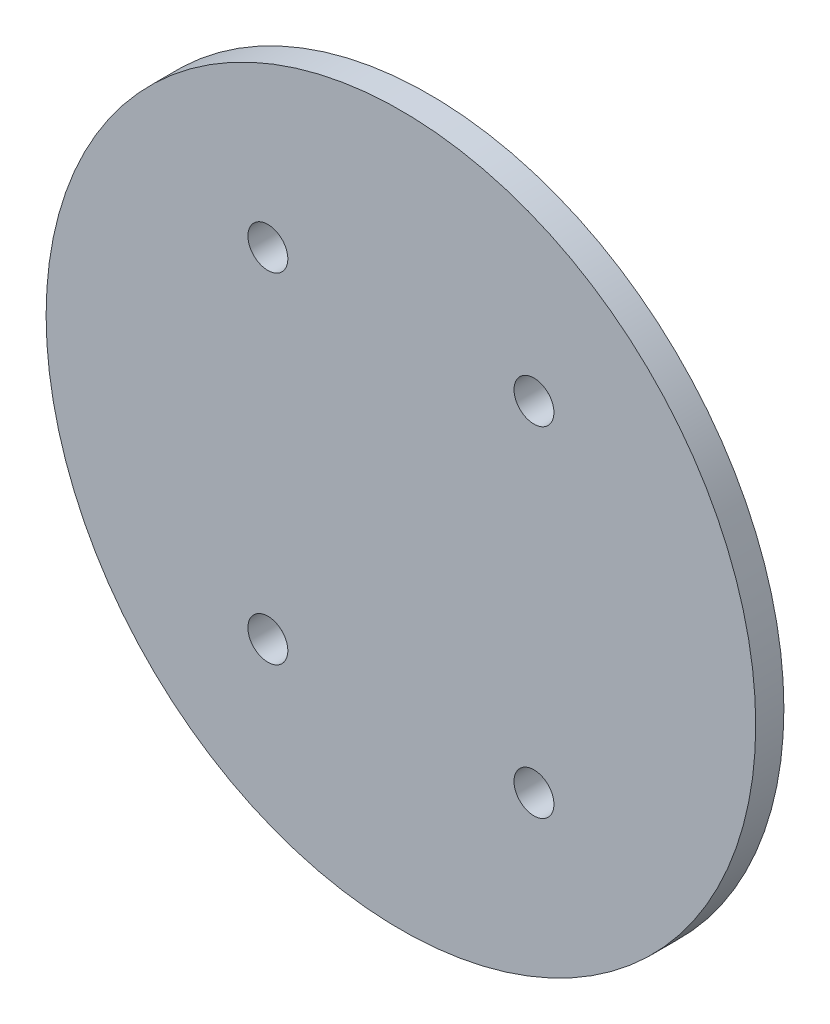
ISO-10303-21;
HEADER;
FILE_DESCRIPTION(('STEP AP214'),'2;1');
FILE_NAME('part.step','',(''),(''),'','','');
FILE_SCHEMA(('AUTOMOTIVE_DESIGN { 1 0 10303 214 1 1 1 1 }'));
ENDSEC;
DATA;
#1=APPLICATION_CONTEXT('core data for automotive mechanical design processes');
#2=APPLICATION_PROTOCOL_DEFINITION('international standard','automotive_design',2000,#1);
#3=PRODUCT_CONTEXT('',#1,'mechanical');
#4=PRODUCT('Part','Part','',(#3));
#5=PRODUCT_RELATED_PRODUCT_CATEGORY('part','',(#4));
#6=PRODUCT_DEFINITION_FORMATION('','',#4);
#7=PRODUCT_DEFINITION_CONTEXT('part definition',#1,'design');
#8=PRODUCT_DEFINITION('design','',#6,#7);
#9=PRODUCT_DEFINITION_SHAPE('','',#8);
#10=(LENGTH_UNIT() NAMED_UNIT(*) SI_UNIT(.MILLI.,.METRE.));
#11=(NAMED_UNIT(*) PLANE_ANGLE_UNIT() SI_UNIT($,.RADIAN.));
#12=(NAMED_UNIT(*) SI_UNIT($,.STERADIAN.) SOLID_ANGLE_UNIT());
#13=UNCERTAINTY_MEASURE_WITH_UNIT(LENGTH_MEASURE(1.E-05),#10,'distance_accuracy_value','');
#14=(GEOMETRIC_REPRESENTATION_CONTEXT(3) GLOBAL_UNCERTAINTY_ASSIGNED_CONTEXT((#13)) GLOBAL_UNIT_ASSIGNED_CONTEXT((#10,
#11,#12)) REPRESENTATION_CONTEXT('',''));
#15=CARTESIAN_POINT('',(0.,0.,0.));
#16=DIRECTION('',(0.,0.,1.));
#17=DIRECTION('',(1.,0.,0.));
#18=AXIS2_PLACEMENT_3D('',#15,#16,#17);
#19=CARTESIAN_POINT('',(0.,0.,-1.5875));
#20=DIRECTION('',(0.,0.,1.));
#21=DIRECTION('',(1.,0.,0.));
#22=AXIS2_PLACEMENT_3D('',#19,#20,#21);
#23=PLANE('',#22);
#24=CARTESIAN_POINT('',(-15.,19.125,-1.5875));
#25=DIRECTION('',(0.,0.,-1.));
#26=DIRECTION('',(-1.,0.,0.));
#27=AXIS2_PLACEMENT_3D('',#24,#25,#26);
#28=CIRCLE('',#27,2.24999999999999);
#29=CARTESIAN_POINT('',(-17.25,19.125,-1.5875));
#30=VERTEX_POINT('',#29);
#31=EDGE_CURVE('E84',#30,#30,#28,.T.);
#32=ORIENTED_EDGE('',*,*,#31,.F.);
#33=EDGE_LOOP('',(#32));
#34=FACE_BOUND('',#33,.T.);
#35=CARTESIAN_POINT('',(15.,19.125,-1.5875));
#36=DIRECTION('',(0.,0.,-1.));
#37=DIRECTION('',(-1.,0.,0.));
#38=AXIS2_PLACEMENT_3D('',#35,#36,#37);
#39=CIRCLE('',#38,2.24999999999999);
#40=CARTESIAN_POINT('',(12.75,19.125,-1.5875));
#41=VERTEX_POINT('',#40);
#42=EDGE_CURVE('E76',#41,#41,#39,.T.);
#43=ORIENTED_EDGE('',*,*,#42,.F.);
#44=EDGE_LOOP('',(#43));
#45=FACE_BOUND('',#44,.T.);
#46=CARTESIAN_POINT('',(15.,-19.125,-1.5875));
#47=DIRECTION('',(0.,0.,-1.));
#48=DIRECTION('',(-1.,0.,0.));
#49=AXIS2_PLACEMENT_3D('',#46,#47,#48);
#50=CIRCLE('',#49,2.24999999999999);
#51=CARTESIAN_POINT('',(12.75,-19.125,-1.5875));
#52=VERTEX_POINT('',#51);
#53=EDGE_CURVE('E68',#52,#52,#50,.T.);
#54=ORIENTED_EDGE('',*,*,#53,.F.);
#55=EDGE_LOOP('',(#54));
#56=FACE_BOUND('',#55,.T.);
#57=CARTESIAN_POINT('',(0.,0.,-1.5875));
#58=DIRECTION('',(0.,0.,1.));
#59=DIRECTION('',(1.,0.,0.));
#60=AXIS2_PLACEMENT_3D('',#57,#58,#59);
#61=CIRCLE('',#60,40.);
#62=CARTESIAN_POINT('',(40.,0.,-1.5875));
#63=VERTEX_POINT('',#62);
#64=EDGE_CURVE('E46',#63,#63,#61,.T.);
#65=ORIENTED_EDGE('',*,*,#64,.F.);
#66=EDGE_LOOP('',(#65));
#67=FACE_BOUND('',#66,.T.);
#68=CARTESIAN_POINT('',(-15.,-19.125,-1.5875));
#69=DIRECTION('',(0.,0.,-1.));
#70=DIRECTION('',(-1.,0.,0.));
#71=AXIS2_PLACEMENT_3D('',#68,#69,#70);
#72=CIRCLE('',#71,2.24999999999999);
#73=CARTESIAN_POINT('',(-17.25,-19.125,-1.5875));
#74=VERTEX_POINT('',#73);
#75=EDGE_CURVE('E60',#74,#74,#72,.T.);
#76=ORIENTED_EDGE('',*,*,#75,.F.);
#77=EDGE_LOOP('',(#76));
#78=FACE_BOUND('',#77,.T.);
#79=ADVANCED_FACE('F42',(#34,#45,#56,#67,#78),#23,.F.);
#80=CARTESIAN_POINT('',(0.,0.,1.5875));
#81=DIRECTION('',(0.,0.,-1.));
#82=DIRECTION('',(-1.,0.,0.));
#83=AXIS2_PLACEMENT_3D('',#80,#81,#82);
#84=CYLINDRICAL_SURFACE('',#83,40.);
#85=CARTESIAN_POINT('',(0.,0.,1.5875));
#86=DIRECTION('',(0.,0.,1.));
#87=DIRECTION('',(1.,0.,0.));
#88=AXIS2_PLACEMENT_3D('',#85,#86,#87);
#89=CIRCLE('',#88,40.);
#90=CARTESIAN_POINT('',(40.,0.,1.5875));
#91=VERTEX_POINT('',#90);
#92=EDGE_CURVE('E10',#91,#91,#89,.T.);
#93=ORIENTED_EDGE('',*,*,#92,.F.);
#94=EDGE_LOOP('',(#93));
#95=FACE_BOUND('',#94,.T.);
#96=ORIENTED_EDGE('',*,*,#64,.T.);
#97=EDGE_LOOP('',(#96));
#98=FACE_BOUND('',#97,.T.);
#99=ADVANCED_FACE('F44',(#95,#98),#84,.T.);
#100=CARTESIAN_POINT('',(0.,0.,1.5875));
#101=DIRECTION('',(0.,0.,1.));
#102=DIRECTION('',(1.,0.,0.));
#103=AXIS2_PLACEMENT_3D('',#100,#101,#102);
#104=PLANE('',#103);
#105=CARTESIAN_POINT('',(-15.,19.125,1.5875));
#106=DIRECTION('',(0.,0.,-1.));
#107=DIRECTION('',(-1.,0.,0.));
#108=AXIS2_PLACEMENT_3D('',#105,#106,#107);
#109=CIRCLE('',#108,2.25);
#110=CARTESIAN_POINT('',(-17.25,19.125,1.5875));
#111=VERTEX_POINT('',#110);
#112=EDGE_CURVE('E80',#111,#111,#109,.T.);
#113=ORIENTED_EDGE('',*,*,#112,.T.);
#114=EDGE_LOOP('',(#113));
#115=FACE_BOUND('',#114,.T.);
#116=CARTESIAN_POINT('',(15.,19.125,1.5875));
#117=DIRECTION('',(0.,0.,-1.));
#118=DIRECTION('',(-1.,0.,0.));
#119=AXIS2_PLACEMENT_3D('',#116,#117,#118);
#120=CIRCLE('',#119,2.25);
#121=CARTESIAN_POINT('',(12.75,19.125,1.5875));
#122=VERTEX_POINT('',#121);
#123=EDGE_CURVE('E72',#122,#122,#120,.T.);
#124=ORIENTED_EDGE('',*,*,#123,.T.);
#125=EDGE_LOOP('',(#124));
#126=FACE_BOUND('',#125,.T.);
#127=CARTESIAN_POINT('',(15.,-19.125,1.5875));
#128=DIRECTION('',(0.,0.,-1.));
#129=DIRECTION('',(-1.,0.,0.));
#130=AXIS2_PLACEMENT_3D('',#127,#128,#129);
#131=CIRCLE('',#130,2.25);
#132=CARTESIAN_POINT('',(12.75,-19.125,1.5875));
#133=VERTEX_POINT('',#132);
#134=EDGE_CURVE('E64',#133,#133,#131,.T.);
#135=ORIENTED_EDGE('',*,*,#134,.T.);
#136=EDGE_LOOP('',(#135));
#137=FACE_BOUND('',#136,.T.);
#138=CARTESIAN_POINT('',(-15.,-19.125,1.5875));
#139=DIRECTION('',(0.,0.,-1.));
#140=DIRECTION('',(-1.,0.,0.));
#141=AXIS2_PLACEMENT_3D('',#138,#139,#140);
#142=CIRCLE('',#141,2.25);
#143=CARTESIAN_POINT('',(-17.25,-19.125,1.5875));
#144=VERTEX_POINT('',#143);
#145=EDGE_CURVE('E55',#144,#144,#142,.T.);
#146=ORIENTED_EDGE('',*,*,#145,.T.);
#147=EDGE_LOOP('',(#146));
#148=FACE_BOUND('',#147,.T.);
#149=ORIENTED_EDGE('',*,*,#92,.T.);
#150=EDGE_LOOP('',(#149));
#151=FACE_BOUND('',#150,.T.);
#152=ADVANCED_FACE('F104',(#115,#126,#137,#148,#151),#104,.T.);
#153=CARTESIAN_POINT('',(-15.,-19.125,-1.5875));
#154=DIRECTION('',(0.,0.,-1.));
#155=DIRECTION('',(-1.,0.,0.));
#156=AXIS2_PLACEMENT_3D('',#153,#154,#155);
#157=CYLINDRICAL_SURFACE('',#156,2.24999999999999);
#158=ORIENTED_EDGE('',*,*,#145,.F.);
#159=EDGE_LOOP('',(#158));
#160=FACE_BOUND('',#159,.T.);
#161=ORIENTED_EDGE('',*,*,#75,.T.);
#162=EDGE_LOOP('',(#161));
#163=FACE_BOUND('',#162,.T.);
#164=ADVANCED_FACE('F101',(#160,#163),#157,.F.);
#165=CARTESIAN_POINT('',(15.,-19.125,-1.5875));
#166=DIRECTION('',(0.,0.,-1.));
#167=DIRECTION('',(-1.,0.,0.));
#168=AXIS2_PLACEMENT_3D('',#165,#166,#167);
#169=CYLINDRICAL_SURFACE('',#168,2.24999999999999);
#170=ORIENTED_EDGE('',*,*,#134,.F.);
#171=EDGE_LOOP('',(#170));
#172=FACE_BOUND('',#171,.T.);
#173=ORIENTED_EDGE('',*,*,#53,.T.);
#174=EDGE_LOOP('',(#173));
#175=FACE_BOUND('',#174,.T.);
#176=ADVANCED_FACE('F103',(#172,#175),#169,.F.);
#177=CARTESIAN_POINT('',(15.,19.125,-1.5875));
#178=DIRECTION('',(0.,0.,-1.));
#179=DIRECTION('',(-1.,0.,0.));
#180=AXIS2_PLACEMENT_3D('',#177,#178,#179);
#181=CYLINDRICAL_SURFACE('',#180,2.24999999999999);
#182=ORIENTED_EDGE('',*,*,#123,.F.);
#183=EDGE_LOOP('',(#182));
#184=FACE_BOUND('',#183,.T.);
#185=ORIENTED_EDGE('',*,*,#42,.T.);
#186=EDGE_LOOP('',(#185));
#187=FACE_BOUND('',#186,.T.);
#188=ADVANCED_FACE('F111',(#184,#187),#181,.F.);
#189=CARTESIAN_POINT('',(-15.,19.125,-1.5875));
#190=DIRECTION('',(0.,0.,-1.));
#191=DIRECTION('',(-1.,0.,0.));
#192=AXIS2_PLACEMENT_3D('',#189,#190,#191);
#193=CYLINDRICAL_SURFACE('',#192,2.24999999999999);
#194=ORIENTED_EDGE('',*,*,#112,.F.);
#195=EDGE_LOOP('',(#194));
#196=FACE_BOUND('',#195,.T.);
#197=ORIENTED_EDGE('',*,*,#31,.T.);
#198=EDGE_LOOP('',(#197));
#199=FACE_BOUND('',#198,.T.);
#200=ADVANCED_FACE('F89',(#196,#199),#193,.F.);
#201=CLOSED_SHELL('',(#79,#99,#152,#164,#176,#188,#200));
#202=MANIFOLD_SOLID_BREP('B2',#201);
#203=ADVANCED_BREP_SHAPE_REPRESENTATION('',(#18,#202),#14);
#204=SHAPE_DEFINITION_REPRESENTATION(#9,#203);
ENDSEC;
END-ISO-10303-21;
